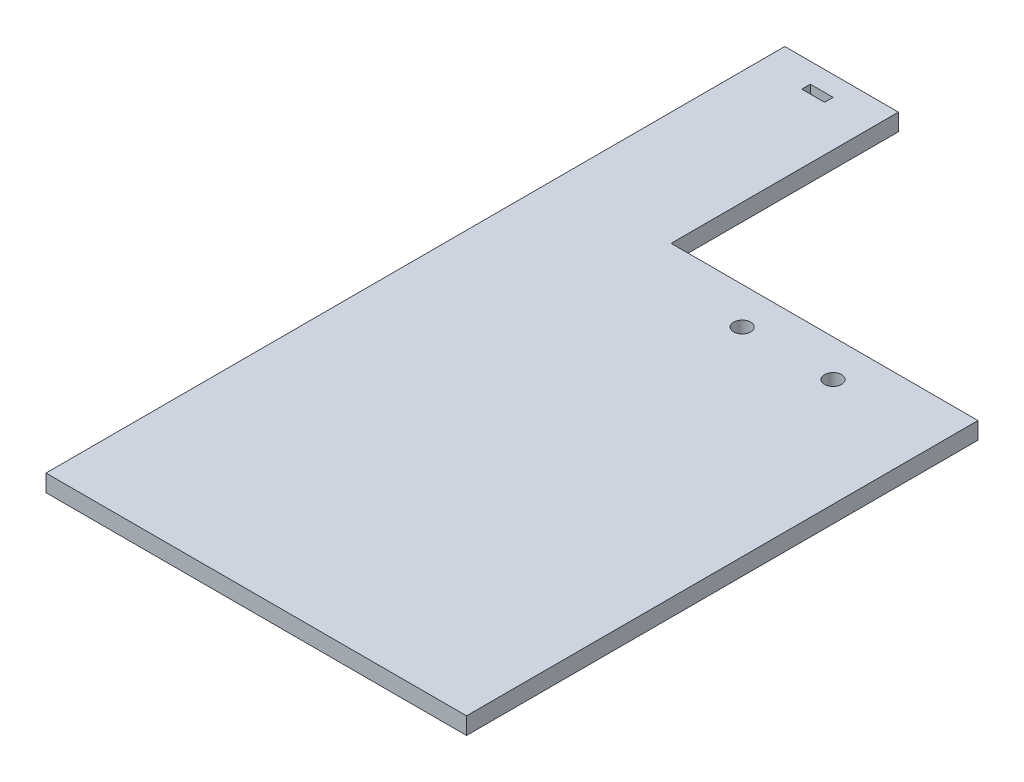
ISO-10303-21;
HEADER;
FILE_DESCRIPTION(('STEP AP214'),'2;1');
FILE_NAME('part.step','',(''),(''),'','','');
FILE_SCHEMA(('AUTOMOTIVE_DESIGN { 1 0 10303 214 1 1 1 1 }'));
ENDSEC;
DATA;
#1=APPLICATION_CONTEXT('core data for automotive mechanical design processes');
#2=APPLICATION_PROTOCOL_DEFINITION('international standard','automotive_design',2000,#1);
#3=PRODUCT_CONTEXT('',#1,'mechanical');
#4=PRODUCT('Part','Part','',(#3));
#5=PRODUCT_RELATED_PRODUCT_CATEGORY('part','',(#4));
#6=PRODUCT_DEFINITION_FORMATION('','',#4);
#7=PRODUCT_DEFINITION_CONTEXT('part definition',#1,'design');
#8=PRODUCT_DEFINITION('design','',#6,#7);
#9=PRODUCT_DEFINITION_SHAPE('','',#8);
#10=(LENGTH_UNIT() NAMED_UNIT(*) SI_UNIT(.MILLI.,.METRE.));
#11=(NAMED_UNIT(*) PLANE_ANGLE_UNIT() SI_UNIT($,.RADIAN.));
#12=(NAMED_UNIT(*) SI_UNIT($,.STERADIAN.) SOLID_ANGLE_UNIT());
#13=UNCERTAINTY_MEASURE_WITH_UNIT(LENGTH_MEASURE(1.E-05),#10,'distance_accuracy_value','');
#14=(GEOMETRIC_REPRESENTATION_CONTEXT(3) GLOBAL_UNCERTAINTY_ASSIGNED_CONTEXT((#13)) GLOBAL_UNIT_ASSIGNED_CONTEXT((#10,
#11,#12)) REPRESENTATION_CONTEXT('',''));
#15=CARTESIAN_POINT('',(0.,0.,0.));
#16=DIRECTION('',(0.,0.,1.));
#17=DIRECTION('',(1.,0.,0.));
#18=AXIS2_PLACEMENT_3D('',#15,#16,#17);
#19=CARTESIAN_POINT('',(0.,3.,0.));
#20=DIRECTION('',(0.,-1.,0.));
#21=DIRECTION('',(0.,0.,-1.));
#22=AXIS2_PLACEMENT_3D('',#19,#20,#21);
#23=PLANE('',#22);
#24=CARTESIAN_POINT('',(39.,3.,-83.5));
#25=DIRECTION('',(0.,1.,0.));
#26=DIRECTION('',(0.,0.,1.));
#27=AXIS2_PLACEMENT_3D('',#24,#25,#26);
#28=CIRCLE('',#27,1.5);
#29=CARTESIAN_POINT('',(39.,3.,-82.));
#30=VERTEX_POINT('',#29);
#31=EDGE_CURVE('E190',#30,#30,#28,.T.);
#32=ORIENTED_EDGE('',*,*,#31,.F.);
#33=EDGE_LOOP('',(#32));
#34=FACE_BOUND('',#33,.T.);
#35=CARTESIAN_POINT('',(55.,3.,-83.5));
#36=DIRECTION('',(0.,1.,0.));
#37=DIRECTION('',(0.,0.,1.));
#38=AXIS2_PLACEMENT_3D('',#35,#36,#37);
#39=CIRCLE('',#38,1.5);
#40=CARTESIAN_POINT('',(55.,3.,-82.));
#41=VERTEX_POINT('',#40);
#42=EDGE_CURVE('E197',#41,#41,#39,.T.);
#43=ORIENTED_EDGE('',*,*,#42,.F.);
#44=EDGE_LOOP('',(#43));
#45=FACE_BOUND('',#44,.T.);
#46=DIRECTION('',(1.,0.,0.));
#47=VECTOR('',#46,1.);
#48=CARTESIAN_POINT('',(0.,3.,0.));
#49=LINE('',#48,#47);
#50=CARTESIAN_POINT('',(0.,3.,0.));
#51=VERTEX_POINT('',#50);
#52=CARTESIAN_POINT('',(74.,3.,0.));
#53=VERTEX_POINT('',#52);
#54=EDGE_CURVE('E134',#51,#53,#49,.T.);
#55=ORIENTED_EDGE('',*,*,#54,.T.);
#56=DIRECTION('',(0.,0.,1.));
#57=VECTOR('',#56,1.);
#58=CARTESIAN_POINT('',(74.,3.,-130.));
#59=LINE('',#58,#57);
#60=CARTESIAN_POINT('',(74.,3.,-90.));
#61=VERTEX_POINT('',#60);
#62=EDGE_CURVE('E122',#61,#53,#59,.T.);
#63=ORIENTED_EDGE('',*,*,#62,.F.);
#64=DIRECTION('',(-1.,0.,0.));
#65=VECTOR('',#64,1.);
#66=CARTESIAN_POINT('',(20.,3.,-90.));
#67=LINE('',#66,#65);
#68=CARTESIAN_POINT('',(20.,3.,-90.));
#69=VERTEX_POINT('',#68);
#70=EDGE_CURVE('E145',#61,#69,#67,.T.);
#71=ORIENTED_EDGE('',*,*,#70,.T.);
#72=DIRECTION('',(0.,0.,-1.));
#73=VECTOR('',#72,1.);
#74=CARTESIAN_POINT('',(20.,3.,-130.));
#75=LINE('',#74,#73);
#76=CARTESIAN_POINT('',(20.,3.,-130.));
#77=VERTEX_POINT('',#76);
#78=EDGE_CURVE('E149',#69,#77,#75,.T.);
#79=ORIENTED_EDGE('',*,*,#78,.T.);
#80=DIRECTION('',(-1.,0.,0.));
#81=VECTOR('',#80,1.);
#82=CARTESIAN_POINT('',(0.,3.,-130.));
#83=LINE('',#82,#81);
#84=CARTESIAN_POINT('',(0.,3.,-130.));
#85=VERTEX_POINT('',#84);
#86=EDGE_CURVE('E157',#77,#85,#83,.T.);
#87=ORIENTED_EDGE('',*,*,#86,.T.);
#88=DIRECTION('',(0.,0.,1.));
#89=VECTOR('',#88,1.);
#90=CARTESIAN_POINT('',(0.,3.,0.));
#91=LINE('',#90,#89);
#92=EDGE_CURVE('E142',#85,#51,#91,.T.);
#93=ORIENTED_EDGE('',*,*,#92,.T.);
#94=EDGE_LOOP('',(#55,#63,#71,#79,#87,#93));
#95=FACE_BOUND('',#94,.T.);
#96=DIRECTION('',(0.,0.,1.));
#97=VECTOR('',#96,1.);
#98=CARTESIAN_POINT('',(8.,3.,-126.5));
#99=LINE('',#98,#97);
#100=CARTESIAN_POINT('',(8.,3.,-126.5));
#101=VERTEX_POINT('',#100);
#102=CARTESIAN_POINT('',(8.,3.,-125.));
#103=VERTEX_POINT('',#102);
#104=EDGE_CURVE('E208',#101,#103,#99,.T.);
#105=ORIENTED_EDGE('',*,*,#104,.F.);
#106=DIRECTION('',(-1.,0.,0.));
#107=VECTOR('',#106,1.);
#108=CARTESIAN_POINT('',(8.,3.,-126.5));
#109=LINE('',#108,#107);
#110=CARTESIAN_POINT('',(12.,3.,-126.5));
#111=VERTEX_POINT('',#110);
#112=EDGE_CURVE('E218',#111,#101,#109,.T.);
#113=ORIENTED_EDGE('',*,*,#112,.F.);
#114=DIRECTION('',(0.,0.,-1.));
#115=VECTOR('',#114,1.);
#116=CARTESIAN_POINT('',(12.,3.,-126.5));
#117=LINE('',#116,#115);
#118=CARTESIAN_POINT('',(12.,3.,-125.));
#119=VERTEX_POINT('',#118);
#120=EDGE_CURVE('E215',#119,#111,#117,.T.);
#121=ORIENTED_EDGE('',*,*,#120,.F.);
#122=DIRECTION('',(1.,0.,0.));
#123=VECTOR('',#122,1.);
#124=CARTESIAN_POINT('',(8.,3.,-125.));
#125=LINE('',#124,#123);
#126=EDGE_CURVE('E211',#103,#119,#125,.T.);
#127=ORIENTED_EDGE('',*,*,#126,.F.);
#128=EDGE_LOOP('',(#105,#113,#121,#127));
#129=FACE_BOUND('',#128,.T.);
#130=ADVANCED_FACE('F45',(#34,#45,#95,#129),#23,.F.);
#131=CARTESIAN_POINT('',(0.,0.,0.));
#132=DIRECTION('',(0.,-1.,0.));
#133=DIRECTION('',(0.,0.,-1.));
#134=AXIS2_PLACEMENT_3D('',#131,#132,#133);
#135=PLANE('',#134);
#136=CARTESIAN_POINT('',(39.,0.,-83.5));
#137=DIRECTION('',(0.,-1.,0.));
#138=DIRECTION('',(0.,0.,-1.));
#139=AXIS2_PLACEMENT_3D('',#136,#137,#138);
#140=CIRCLE('',#139,1.5);
#141=CARTESIAN_POINT('',(39.,0.,-85.));
#142=VERTEX_POINT('',#141);
#143=EDGE_CURVE('E49',#142,#142,#140,.T.);
#144=ORIENTED_EDGE('',*,*,#143,.F.);
#145=EDGE_LOOP('',(#144));
#146=FACE_BOUND('',#145,.T.);
#147=CARTESIAN_POINT('',(55.,0.,-83.5));
#148=DIRECTION('',(0.,-1.,0.));
#149=DIRECTION('',(0.,0.,-1.));
#150=AXIS2_PLACEMENT_3D('',#147,#148,#149);
#151=CIRCLE('',#150,1.5);
#152=CARTESIAN_POINT('',(55.,0.,-85.));
#153=VERTEX_POINT('',#152);
#154=EDGE_CURVE('E187',#153,#153,#151,.T.);
#155=ORIENTED_EDGE('',*,*,#154,.F.);
#156=EDGE_LOOP('',(#155));
#157=FACE_BOUND('',#156,.T.);
#158=DIRECTION('',(0.,0.,1.));
#159=VECTOR('',#158,1.);
#160=CARTESIAN_POINT('',(74.,0.,-130.));
#161=LINE('',#160,#159);
#162=CARTESIAN_POINT('',(74.,0.,-90.));
#163=VERTEX_POINT('',#162);
#164=CARTESIAN_POINT('',(74.,0.,0.));
#165=VERTEX_POINT('',#164);
#166=EDGE_CURVE('E63',#163,#165,#161,.T.);
#167=ORIENTED_EDGE('',*,*,#166,.T.);
#168=DIRECTION('',(1.,0.,0.));
#169=VECTOR('',#168,1.);
#170=CARTESIAN_POINT('',(0.,0.,0.));
#171=LINE('',#170,#169);
#172=CARTESIAN_POINT('',(0.,0.,0.));
#173=VERTEX_POINT('',#172);
#174=EDGE_CURVE('E137',#173,#165,#171,.T.);
#175=ORIENTED_EDGE('',*,*,#174,.F.);
#176=DIRECTION('',(0.,0.,1.));
#177=VECTOR('',#176,1.);
#178=CARTESIAN_POINT('',(0.,0.,-90.));
#179=LINE('',#178,#177);
#180=CARTESIAN_POINT('',(0.,0.,-130.));
#181=VERTEX_POINT('',#180);
#182=EDGE_CURVE('E151',#181,#173,#179,.T.);
#183=ORIENTED_EDGE('',*,*,#182,.F.);
#184=DIRECTION('',(-1.,0.,0.));
#185=VECTOR('',#184,1.);
#186=CARTESIAN_POINT('',(0.,0.,-130.));
#187=LINE('',#186,#185);
#188=CARTESIAN_POINT('',(20.,0.,-130.));
#189=VERTEX_POINT('',#188);
#190=EDGE_CURVE('E170',#189,#181,#187,.T.);
#191=ORIENTED_EDGE('',*,*,#190,.F.);
#192=DIRECTION('',(0.,0.,-1.));
#193=VECTOR('',#192,1.);
#194=CARTESIAN_POINT('',(20.,0.,-130.));
#195=LINE('',#194,#193);
#196=CARTESIAN_POINT('',(20.,0.,-90.));
#197=VERTEX_POINT('',#196);
#198=EDGE_CURVE('E167',#197,#189,#195,.T.);
#199=ORIENTED_EDGE('',*,*,#198,.F.);
#200=DIRECTION('',(-1.,0.,0.));
#201=VECTOR('',#200,1.);
#202=CARTESIAN_POINT('',(20.,0.,-90.));
#203=LINE('',#202,#201);
#204=EDGE_CURVE('E163',#163,#197,#203,.T.);
#205=ORIENTED_EDGE('',*,*,#204,.F.);
#206=EDGE_LOOP('',(#167,#175,#183,#191,#199,#205));
#207=FACE_BOUND('',#206,.T.);
#208=DIRECTION('',(-1.,0.,0.));
#209=VECTOR('',#208,1.);
#210=CARTESIAN_POINT('',(8.,0.,-126.5));
#211=LINE('',#210,#209);
#212=CARTESIAN_POINT('',(12.,0.,-126.5));
#213=VERTEX_POINT('',#212);
#214=CARTESIAN_POINT('',(8.,0.,-126.5));
#215=VERTEX_POINT('',#214);
#216=EDGE_CURVE('E212',#213,#215,#211,.T.);
#217=ORIENTED_EDGE('',*,*,#216,.T.);
#218=DIRECTION('',(0.,0.,1.));
#219=VECTOR('',#218,1.);
#220=CARTESIAN_POINT('',(8.,0.,-126.5));
#221=LINE('',#220,#219);
#222=CARTESIAN_POINT('',(8.,0.,-125.));
#223=VERTEX_POINT('',#222);
#224=EDGE_CURVE('E206',#215,#223,#221,.T.);
#225=ORIENTED_EDGE('',*,*,#224,.T.);
#226=DIRECTION('',(1.,0.,0.));
#227=VECTOR('',#226,1.);
#228=CARTESIAN_POINT('',(8.,0.,-125.));
#229=LINE('',#228,#227);
#230=CARTESIAN_POINT('',(12.,0.,-125.));
#231=VERTEX_POINT('',#230);
#232=EDGE_CURVE('E225',#223,#231,#229,.T.);
#233=ORIENTED_EDGE('',*,*,#232,.T.);
#234=DIRECTION('',(0.,0.,-1.));
#235=VECTOR('',#234,1.);
#236=CARTESIAN_POINT('',(12.,0.,-126.5));
#237=LINE('',#236,#235);
#238=EDGE_CURVE('E229',#231,#213,#237,.T.);
#239=ORIENTED_EDGE('',*,*,#238,.T.);
#240=EDGE_LOOP('',(#217,#225,#233,#239));
#241=FACE_BOUND('',#240,.T.);
#242=ADVANCED_FACE('F253',(#146,#157,#207,#241),#135,.T.);
#243=CARTESIAN_POINT('',(0.,3.,0.));
#244=DIRECTION('',(0.,0.,-1.));
#245=DIRECTION('',(-1.,0.,0.));
#246=AXIS2_PLACEMENT_3D('',#243,#244,#245);
#247=PLANE('',#246);
#248=ORIENTED_EDGE('',*,*,#174,.T.);
#249=DIRECTION('',(0.,-1.,0.));
#250=VECTOR('',#249,1.);
#251=CARTESIAN_POINT('',(74.,0.,0.));
#252=LINE('',#251,#250);
#253=EDGE_CURVE('E125',#53,#165,#252,.T.);
#254=ORIENTED_EDGE('',*,*,#253,.F.);
#255=ORIENTED_EDGE('',*,*,#54,.F.);
#256=DIRECTION('',(0.,-1.,0.));
#257=VECTOR('',#256,1.);
#258=CARTESIAN_POINT('',(0.,3.,0.));
#259=LINE('',#258,#257);
#260=EDGE_CURVE('E55',#51,#173,#259,.T.);
#261=ORIENTED_EDGE('',*,*,#260,.T.);
#262=EDGE_LOOP('',(#248,#254,#255,#261));
#263=FACE_BOUND('',#262,.T.);
#264=ADVANCED_FACE('F47',(#263),#247,.F.);
#265=CARTESIAN_POINT('',(20.,3.,-90.));
#266=DIRECTION('',(0.,0.,1.));
#267=DIRECTION('',(1.,0.,0.));
#268=AXIS2_PLACEMENT_3D('',#265,#266,#267);
#269=PLANE('',#268);
#270=ORIENTED_EDGE('',*,*,#70,.F.);
#271=DIRECTION('',(0.,-1.,0.));
#272=VECTOR('',#271,1.);
#273=CARTESIAN_POINT('',(74.,3.,-90.));
#274=LINE('',#273,#272);
#275=EDGE_CURVE('E11',#61,#163,#274,.T.);
#276=ORIENTED_EDGE('',*,*,#275,.T.);
#277=ORIENTED_EDGE('',*,*,#204,.T.);
#278=DIRECTION('',(0.,-1.,0.));
#279=VECTOR('',#278,1.);
#280=CARTESIAN_POINT('',(20.,3.,-90.));
#281=LINE('',#280,#279);
#282=EDGE_CURVE('E182',#69,#197,#281,.T.);
#283=ORIENTED_EDGE('',*,*,#282,.F.);
#284=EDGE_LOOP('',(#270,#276,#277,#283));
#285=FACE_BOUND('',#284,.T.);
#286=ADVANCED_FACE('F292',(#285),#269,.F.);
#287=CARTESIAN_POINT('',(20.,3.,-130.));
#288=DIRECTION('',(-1.,0.,0.));
#289=DIRECTION('',(0.,0.,1.));
#290=AXIS2_PLACEMENT_3D('',#287,#288,#289);
#291=PLANE('',#290);
#292=ORIENTED_EDGE('',*,*,#198,.T.);
#293=DIRECTION('',(0.,-1.,0.));
#294=VECTOR('',#293,1.);
#295=CARTESIAN_POINT('',(20.,3.,-130.));
#296=LINE('',#295,#294);
#297=EDGE_CURVE('E178',#77,#189,#296,.T.);
#298=ORIENTED_EDGE('',*,*,#297,.F.);
#299=ORIENTED_EDGE('',*,*,#78,.F.);
#300=ORIENTED_EDGE('',*,*,#282,.T.);
#301=EDGE_LOOP('',(#292,#298,#299,#300));
#302=FACE_BOUND('',#301,.T.);
#303=ADVANCED_FACE('F289',(#302),#291,.F.);
#304=CARTESIAN_POINT('',(0.,3.,-130.));
#305=DIRECTION('',(0.,0.,1.));
#306=DIRECTION('',(1.,0.,0.));
#307=AXIS2_PLACEMENT_3D('',#304,#305,#306);
#308=PLANE('',#307);
#309=ORIENTED_EDGE('',*,*,#190,.T.);
#310=DIRECTION('',(0.,-1.,0.));
#311=VECTOR('',#310,1.);
#312=CARTESIAN_POINT('',(0.,3.,-130.));
#313=LINE('',#312,#311);
#314=EDGE_CURVE('E160',#85,#181,#313,.T.);
#315=ORIENTED_EDGE('',*,*,#314,.F.);
#316=ORIENTED_EDGE('',*,*,#86,.F.);
#317=ORIENTED_EDGE('',*,*,#297,.T.);
#318=EDGE_LOOP('',(#309,#315,#316,#317));
#319=FACE_BOUND('',#318,.T.);
#320=ADVANCED_FACE('F285',(#319),#308,.F.);
#321=CARTESIAN_POINT('',(0.,3.,-90.));
#322=DIRECTION('',(1.,0.,0.));
#323=DIRECTION('',(0.,0.,-1.));
#324=AXIS2_PLACEMENT_3D('',#321,#322,#323);
#325=PLANE('',#324);
#326=ORIENTED_EDGE('',*,*,#182,.T.);
#327=ORIENTED_EDGE('',*,*,#260,.F.);
#328=ORIENTED_EDGE('',*,*,#92,.F.);
#329=ORIENTED_EDGE('',*,*,#314,.T.);
#330=EDGE_LOOP('',(#326,#327,#328,#329));
#331=FACE_BOUND('',#330,.T.);
#332=ADVANCED_FACE('F282',(#331),#325,.F.);
#333=CARTESIAN_POINT('',(8.,3.,-126.5));
#334=DIRECTION('',(1.,0.,0.));
#335=DIRECTION('',(0.,0.,-1.));
#336=AXIS2_PLACEMENT_3D('',#333,#334,#335);
#337=PLANE('',#336);
#338=ORIENTED_EDGE('',*,*,#224,.F.);
#339=DIRECTION('',(0.,-1.,0.));
#340=VECTOR('',#339,1.);
#341=CARTESIAN_POINT('',(8.,3.,-126.5));
#342=LINE('',#341,#340);
#343=EDGE_CURVE('E221',#101,#215,#342,.T.);
#344=ORIENTED_EDGE('',*,*,#343,.F.);
#345=ORIENTED_EDGE('',*,*,#104,.T.);
#346=DIRECTION('',(0.,-1.,0.));
#347=VECTOR('',#346,1.);
#348=CARTESIAN_POINT('',(8.,3.,-125.));
#349=LINE('',#348,#347);
#350=EDGE_CURVE('E164',#103,#223,#349,.T.);
#351=ORIENTED_EDGE('',*,*,#350,.T.);
#352=EDGE_LOOP('',(#338,#344,#345,#351));
#353=FACE_BOUND('',#352,.T.);
#354=ADVANCED_FACE('F247',(#353),#337,.T.);
#355=CARTESIAN_POINT('',(8.,3.,-125.));
#356=DIRECTION('',(0.,0.,-1.));
#357=DIRECTION('',(-1.,0.,0.));
#358=AXIS2_PLACEMENT_3D('',#355,#356,#357);
#359=PLANE('',#358);
#360=ORIENTED_EDGE('',*,*,#232,.F.);
#361=ORIENTED_EDGE('',*,*,#350,.F.);
#362=ORIENTED_EDGE('',*,*,#126,.T.);
#363=DIRECTION('',(0.,-1.,0.));
#364=VECTOR('',#363,1.);
#365=CARTESIAN_POINT('',(12.,3.,-125.));
#366=LINE('',#365,#364);
#367=EDGE_CURVE('E241',#119,#231,#366,.T.);
#368=ORIENTED_EDGE('',*,*,#367,.T.);
#369=EDGE_LOOP('',(#360,#361,#362,#368));
#370=FACE_BOUND('',#369,.T.);
#371=ADVANCED_FACE('F259',(#370),#359,.T.);
#372=CARTESIAN_POINT('',(12.,3.,-126.5));
#373=DIRECTION('',(-1.,0.,0.));
#374=DIRECTION('',(0.,0.,1.));
#375=AXIS2_PLACEMENT_3D('',#372,#373,#374);
#376=PLANE('',#375);
#377=ORIENTED_EDGE('',*,*,#238,.F.);
#378=ORIENTED_EDGE('',*,*,#367,.F.);
#379=ORIENTED_EDGE('',*,*,#120,.T.);
#380=DIRECTION('',(0.,-1.,0.));
#381=VECTOR('',#380,1.);
#382=CARTESIAN_POINT('',(12.,3.,-126.5));
#383=LINE('',#382,#381);
#384=EDGE_CURVE('E70',#111,#213,#383,.T.);
#385=ORIENTED_EDGE('',*,*,#384,.T.);
#386=EDGE_LOOP('',(#377,#378,#379,#385));
#387=FACE_BOUND('',#386,.T.);
#388=ADVANCED_FACE('F261',(#387),#376,.T.);
#389=CARTESIAN_POINT('',(8.,3.,-126.5));
#390=DIRECTION('',(0.,0.,1.));
#391=DIRECTION('',(1.,0.,0.));
#392=AXIS2_PLACEMENT_3D('',#389,#390,#391);
#393=PLANE('',#392);
#394=ORIENTED_EDGE('',*,*,#216,.F.);
#395=ORIENTED_EDGE('',*,*,#384,.F.);
#396=ORIENTED_EDGE('',*,*,#112,.T.);
#397=ORIENTED_EDGE('',*,*,#343,.T.);
#398=EDGE_LOOP('',(#394,#395,#396,#397));
#399=FACE_BOUND('',#398,.T.);
#400=ADVANCED_FACE('F255',(#399),#393,.T.);
#401=CARTESIAN_POINT('',(74.,0.,-130.));
#402=DIRECTION('',(-1.,0.,0.));
#403=DIRECTION('',(0.,0.,1.));
#404=AXIS2_PLACEMENT_3D('',#401,#402,#403);
#405=PLANE('',#404);
#406=ORIENTED_EDGE('',*,*,#62,.T.);
#407=ORIENTED_EDGE('',*,*,#253,.T.);
#408=ORIENTED_EDGE('',*,*,#166,.F.);
#409=ORIENTED_EDGE('',*,*,#275,.F.);
#410=EDGE_LOOP('',(#406,#407,#408,#409));
#411=FACE_BOUND('',#410,.T.);
#412=ADVANCED_FACE('F124',(#411),#405,.F.);
#413=CARTESIAN_POINT('',(55.,-7.,-83.5));
#414=DIRECTION('',(0.,1.,0.));
#415=DIRECTION('',(0.,0.,1.));
#416=AXIS2_PLACEMENT_3D('',#413,#414,#415);
#417=CYLINDRICAL_SURFACE('',#416,1.5);
#418=ORIENTED_EDGE('',*,*,#154,.T.);
#419=EDGE_LOOP('',(#418));
#420=FACE_BOUND('',#419,.T.);
#421=ORIENTED_EDGE('',*,*,#42,.T.);
#422=EDGE_LOOP('',(#421));
#423=FACE_BOUND('',#422,.T.);
#424=ADVANCED_FACE('F330',(#420,#423),#417,.F.);
#425=CARTESIAN_POINT('',(39.,-7.,-83.5));
#426=DIRECTION('',(0.,1.,0.));
#427=DIRECTION('',(0.,0.,1.));
#428=AXIS2_PLACEMENT_3D('',#425,#426,#427);
#429=CYLINDRICAL_SURFACE('',#428,1.5);
#430=ORIENTED_EDGE('',*,*,#143,.T.);
#431=EDGE_LOOP('',(#430));
#432=FACE_BOUND('',#431,.T.);
#433=ORIENTED_EDGE('',*,*,#31,.T.);
#434=EDGE_LOOP('',(#433));
#435=FACE_BOUND('',#434,.T.);
#436=ADVANCED_FACE('F339',(#432,#435),#429,.F.);
#437=CLOSED_SHELL('',(#130,#242,#264,#286,#303,#320,#332,#354,#371,#388,#400,#412,#424,#436));
#438=MANIFOLD_SOLID_BREP('B2',#437);
#439=ADVANCED_BREP_SHAPE_REPRESENTATION('',(#18,#438),#14);
#440=SHAPE_DEFINITION_REPRESENTATION(#9,#439);
ENDSEC;
END-ISO-10303-21;
